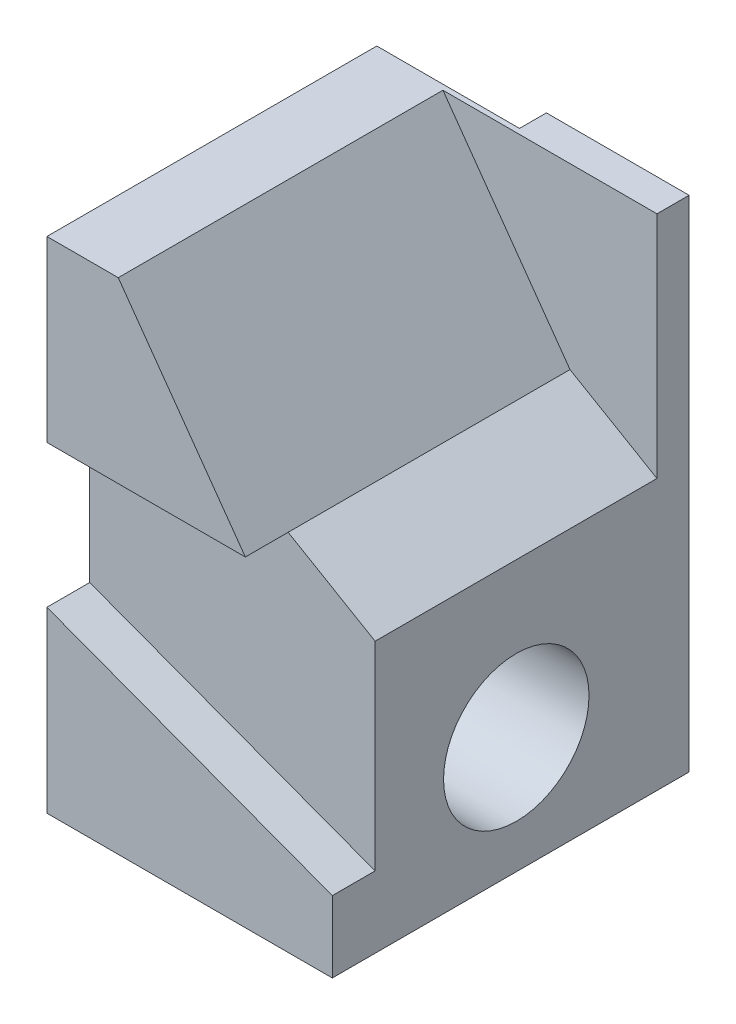
ISO-10303-21;
HEADER;
FILE_DESCRIPTION(('STEP AP214'),'2;1');
FILE_NAME('part.step','',(''),(''),'','','');
FILE_SCHEMA(('AUTOMOTIVE_DESIGN { 1 0 10303 214 1 1 1 1 }'));
ENDSEC;
DATA;
#1=APPLICATION_CONTEXT('core data for automotive mechanical design processes');
#2=APPLICATION_PROTOCOL_DEFINITION('international standard','automotive_design',2000,#1);
#3=PRODUCT_CONTEXT('',#1,'mechanical');
#4=PRODUCT('Part','Part','',(#3));
#5=PRODUCT_RELATED_PRODUCT_CATEGORY('part','',(#4));
#6=PRODUCT_DEFINITION_FORMATION('','',#4);
#7=PRODUCT_DEFINITION_CONTEXT('part definition',#1,'design');
#8=PRODUCT_DEFINITION('design','',#6,#7);
#9=PRODUCT_DEFINITION_SHAPE('','',#8);
#10=(LENGTH_UNIT() NAMED_UNIT(*) SI_UNIT(.MILLI.,.METRE.));
#11=(NAMED_UNIT(*) PLANE_ANGLE_UNIT() SI_UNIT($,.RADIAN.));
#12=(NAMED_UNIT(*) SI_UNIT($,.STERADIAN.) SOLID_ANGLE_UNIT());
#13=UNCERTAINTY_MEASURE_WITH_UNIT(LENGTH_MEASURE(1.E-05),#10,'distance_accuracy_value','');
#14=(GEOMETRIC_REPRESENTATION_CONTEXT(3) GLOBAL_UNCERTAINTY_ASSIGNED_CONTEXT((#13)) GLOBAL_UNIT_ASSIGNED_CONTEXT((#10,
#11,#12)) REPRESENTATION_CONTEXT('',''));
#15=CARTESIAN_POINT('',(0.,0.,0.));
#16=DIRECTION('',(0.,0.,1.));
#17=DIRECTION('',(1.,0.,0.));
#18=AXIS2_PLACEMENT_3D('',#15,#16,#17);
#19=CARTESIAN_POINT('',(-40.,90.,56.));
#20=DIRECTION('',(0.,1.,0.));
#21=DIRECTION('',(0.,0.,1.));
#22=AXIS2_PLACEMENT_3D('',#19,#20,#21);
#23=PLANE('',#22);
#24=DIRECTION('',(1.,0.,0.));
#25=VECTOR('',#24,1.);
#26=CARTESIAN_POINT('',(-40.,90.,44.));
#27=LINE('',#26,#25);
#28=CARTESIAN_POINT('',(-40.,90.,44.));
#29=VERTEX_POINT('',#28);
#30=CARTESIAN_POINT('',(15.6191609276927,90.,44.));
#31=VERTEX_POINT('',#30);
#32=EDGE_CURVE('E172',#29,#31,#27,.T.);
#33=ORIENTED_EDGE('',*,*,#32,.T.);
#34=DIRECTION('',(0.,0.,-1.));
#35=VECTOR('',#34,1.);
#36=CARTESIAN_POINT('',(15.6191609276927,90.,56.));
#37=LINE('',#36,#35);
#38=CARTESIAN_POINT('',(15.6191609276927,90.,56.));
#39=VERTEX_POINT('',#38);
#40=EDGE_CURVE('E157',#39,#31,#37,.T.);
#41=ORIENTED_EDGE('',*,*,#40,.F.);
#42=DIRECTION('',(1.,0.,0.));
#43=VECTOR('',#42,1.);
#44=CARTESIAN_POINT('',(-40.,90.,56.));
#45=LINE('',#44,#43);
#46=CARTESIAN_POINT('',(-40.,90.,56.));
#47=VERTEX_POINT('',#46);
#48=EDGE_CURVE('E178',#47,#39,#45,.T.);
#49=ORIENTED_EDGE('',*,*,#48,.F.);
#50=DIRECTION('',(0.,0.,-1.));
#51=VECTOR('',#50,1.);
#52=CARTESIAN_POINT('',(-40.,90.,56.));
#53=LINE('',#52,#51);
#54=EDGE_CURVE('E187',#47,#29,#53,.T.);
#55=ORIENTED_EDGE('',*,*,#54,.T.);
#56=EDGE_LOOP('',(#33,#41,#49,#55));
#57=FACE_BOUND('',#56,.T.);
#58=ADVANCED_FACE('F41',(#57),#23,.F.);
#59=CARTESIAN_POINT('',(0.,0.,-35.));
#60=DIRECTION('',(0.,0.,1.));
#61=DIRECTION('',(1.,0.,0.));
#62=AXIS2_PLACEMENT_3D('',#59,#60,#61);
#63=PLANE('',#62);
#64=DIRECTION('',(0.580214347267117,-0.814463818242034,0.));
#65=VECTOR('',#64,1.);
#66=CARTESIAN_POINT('',(-20.0002450097908,140.,-35.));
#67=LINE('',#66,#65);
#68=CARTESIAN_POINT('',(-20.0002450097908,140.,-35.));
#69=VERTEX_POINT('',#68);
#70=CARTESIAN_POINT('',(15.6191609276927,90.,-35.));
#71=VERTEX_POINT('',#70);
#72=EDGE_CURVE('E153',#69,#71,#67,.T.);
#73=ORIENTED_EDGE('',*,*,#72,.T.);
#74=DIRECTION('',(0.863497012204882,-0.50435395300646,0.));
#75=VECTOR('',#74,1.);
#76=CARTESIAN_POINT('',(15.6191609276927,90.,-35.));
#77=LINE('',#76,#75);
#78=CARTESIAN_POINT('',(40.,75.759565592087,-35.));
#79=VERTEX_POINT('',#78);
#80=EDGE_CURVE('E137',#71,#79,#77,.T.);
#81=ORIENTED_EDGE('',*,*,#80,.T.);
#82=DIRECTION('',(0.,1.,0.));
#83=VECTOR('',#82,1.);
#84=CARTESIAN_POINT('',(40.,90.,-35.));
#85=LINE('',#84,#83);
#86=CARTESIAN_POINT('',(40.,140.,-35.));
#87=VERTEX_POINT('',#86);
#88=EDGE_CURVE('E163',#79,#87,#85,.T.);
#89=ORIENTED_EDGE('',*,*,#88,.T.);
#90=DIRECTION('',(-1.,0.,0.));
#91=VECTOR('',#90,1.);
#92=CARTESIAN_POINT('',(-20.0002450097908,140.,-35.));
#93=LINE('',#92,#91);
#94=EDGE_CURVE('E162',#87,#69,#93,.T.);
#95=ORIENTED_EDGE('',*,*,#94,.T.);
#96=EDGE_LOOP('',(#73,#81,#89,#95));
#97=FACE_BOUND('',#96,.T.);
#98=ADVANCED_FACE('F160',(#97),#63,.T.);
#99=CARTESIAN_POINT('',(-40.,50.,44.));
#100=DIRECTION('',(0.,0.,-1.));
#101=DIRECTION('',(-1.,0.,0.));
#102=AXIS2_PLACEMENT_3D('',#99,#100,#101);
#103=PLANE('',#102);
#104=DIRECTION('',(0.,-1.,0.));
#105=VECTOR('',#104,1.);
#106=CARTESIAN_POINT('',(40.,50.,44.));
#107=LINE('',#106,#105);
#108=CARTESIAN_POINT('',(40.,75.759565592087,44.));
#109=VERTEX_POINT('',#108);
#110=CARTESIAN_POINT('',(40.,20.,44.));
#111=VERTEX_POINT('',#110);
#112=EDGE_CURVE('E237',#109,#111,#107,.T.);
#113=ORIENTED_EDGE('',*,*,#112,.F.);
#114=DIRECTION('',(0.863497012204882,-0.50435395300646,0.));
#115=VECTOR('',#114,1.);
#116=CARTESIAN_POINT('',(15.6191609276927,90.,44.));
#117=LINE('',#116,#115);
#118=EDGE_CURVE('E146',#31,#109,#117,.T.);
#119=ORIENTED_EDGE('',*,*,#118,.F.);
#120=ORIENTED_EDGE('',*,*,#32,.F.);
#121=DIRECTION('',(0.,-1.,0.));
#122=VECTOR('',#121,1.);
#123=CARTESIAN_POINT('',(-40.,140.,44.));
#124=LINE('',#123,#122);
#125=CARTESIAN_POINT('',(-40.,50.,44.));
#126=VERTEX_POINT('',#125);
#127=EDGE_CURVE('E200',#29,#126,#124,.T.);
#128=ORIENTED_EDGE('',*,*,#127,.T.);
#129=DIRECTION('',(-0.936329177569045,0.351123441588392,0.));
#130=VECTOR('',#129,1.);
#131=CARTESIAN_POINT('',(-40.,50.,44.));
#132=LINE('',#131,#130);
#133=EDGE_CURVE('E213',#111,#126,#132,.T.);
#134=ORIENTED_EDGE('',*,*,#133,.F.);
#135=EDGE_LOOP('',(#113,#119,#120,#128,#134));
#136=FACE_BOUND('',#135,.T.);
#137=ADVANCED_FACE('F267',(#136),#103,.F.);
#138=CARTESIAN_POINT('',(0.,50.,0.));
#139=DIRECTION('',(0.,1.,0.));
#140=DIRECTION('',(0.,0.,1.));
#141=AXIS2_PLACEMENT_3D('',#138,#139,#140);
#142=PLANE('',#141);
#143=DIRECTION('',(-1.,0.,0.));
#144=VECTOR('',#143,1.);
#145=CARTESIAN_POINT('',(-40.,50.,-36.4645937721648));
#146=LINE('',#145,#144);
#147=CARTESIAN_POINT('',(0.,50.,-36.4645937721648));
#148=VERTEX_POINT('',#147);
#149=CARTESIAN_POINT('',(-40.,50.,-36.4645937721648));
#150=VERTEX_POINT('',#149);
#151=EDGE_CURVE('E56',#148,#150,#146,.T.);
#152=ORIENTED_EDGE('',*,*,#151,.F.);
#153=DIRECTION('',(0.,0.,1.));
#154=VECTOR('',#153,1.);
#155=CARTESIAN_POINT('',(0.,50.,-36.4645937721648));
#156=LINE('',#155,#154);
#157=CARTESIAN_POINT('',(0.,50.,-44.));
#158=VERTEX_POINT('',#157);
#159=EDGE_CURVE('E189',#158,#148,#156,.T.);
#160=ORIENTED_EDGE('',*,*,#159,.F.);
#161=DIRECTION('',(-1.,0.,0.));
#162=VECTOR('',#161,1.);
#163=CARTESIAN_POINT('',(-40.,50.,-44.));
#164=LINE('',#163,#162);
#165=CARTESIAN_POINT('',(-40.,50.,-44.));
#166=VERTEX_POINT('',#165);
#167=EDGE_CURVE('E233',#158,#166,#164,.T.);
#168=ORIENTED_EDGE('',*,*,#167,.T.);
#169=DIRECTION('',(0.,0.,1.));
#170=VECTOR('',#169,1.);
#171=CARTESIAN_POINT('',(-40.,50.,-44.));
#172=LINE('',#171,#170);
#173=EDGE_CURVE('E61',#166,#150,#172,.T.);
#174=ORIENTED_EDGE('',*,*,#173,.T.);
#175=EDGE_LOOP('',(#152,#160,#168,#174));
#176=FACE_BOUND('',#175,.T.);
#177=ADVANCED_FACE('F287',(#176),#142,.T.);
#178=CARTESIAN_POINT('',(40.,50.,-44.));
#179=DIRECTION('',(-1.,0.,0.));
#180=DIRECTION('',(0.,0.,1.));
#181=AXIS2_PLACEMENT_3D('',#178,#179,#180);
#182=PLANE('',#181);
#183=ORIENTED_EDGE('',*,*,#88,.F.);
#184=DIRECTION('',(0.,0.,1.));
#185=VECTOR('',#184,1.);
#186=CARTESIAN_POINT('',(40.,75.759565592087,-35.));
#187=LINE('',#186,#185);
#188=EDGE_CURVE('E143',#79,#109,#187,.T.);
#189=ORIENTED_EDGE('',*,*,#188,.T.);
#190=ORIENTED_EDGE('',*,*,#112,.T.);
#191=DIRECTION('',(0.,0.,-1.));
#192=VECTOR('',#191,1.);
#193=CARTESIAN_POINT('',(40.,20.,56.));
#194=LINE('',#193,#192);
#195=CARTESIAN_POINT('',(40.,20.,56.));
#196=VERTEX_POINT('',#195);
#197=EDGE_CURVE('E229',#196,#111,#194,.T.);
#198=ORIENTED_EDGE('',*,*,#197,.F.);
#199=DIRECTION('',(0.,1.,0.));
#200=VECTOR('',#199,1.);
#201=CARTESIAN_POINT('',(40.,0.,56.));
#202=LINE('',#201,#200);
#203=CARTESIAN_POINT('',(40.,0.,56.));
#204=VERTEX_POINT('',#203);
#205=EDGE_CURVE('E217',#204,#196,#202,.T.);
#206=ORIENTED_EDGE('',*,*,#205,.F.);
#207=DIRECTION('',(0.,0.,-1.));
#208=VECTOR('',#207,1.);
#209=CARTESIAN_POINT('',(40.,0.,-44.));
#210=LINE('',#209,#208);
#211=CARTESIAN_POINT('',(40.,0.,-44.));
#212=VERTEX_POINT('',#211);
#213=EDGE_CURVE('E232',#204,#212,#210,.T.);
#214=ORIENTED_EDGE('',*,*,#213,.T.);
#215=DIRECTION('',(0.,-1.,0.));
#216=VECTOR('',#215,1.);
#217=CARTESIAN_POINT('',(40.,50.,-44.));
#218=LINE('',#217,#216);
#219=CARTESIAN_POINT('',(40.,140.,-44.));
#220=VERTEX_POINT('',#219);
#221=EDGE_CURVE('E11',#220,#212,#218,.T.);
#222=ORIENTED_EDGE('',*,*,#221,.F.);
#223=DIRECTION('',(0.,0.,-1.));
#224=VECTOR('',#223,1.);
#225=CARTESIAN_POINT('',(40.,140.,-44.));
#226=LINE('',#225,#224);
#227=EDGE_CURVE('E190',#87,#220,#226,.T.);
#228=ORIENTED_EDGE('',*,*,#227,.F.);
#229=EDGE_LOOP('',(#183,#189,#190,#198,#206,#214,#222,#228));
#230=FACE_BOUND('',#229,.T.);
#231=CARTESIAN_POINT('',(40.,32.6116335293358,4.43808390723074));
#232=DIRECTION('',(1.,0.,0.));
#233=DIRECTION('',(0.,0.,-1.));
#234=AXIS2_PLACEMENT_3D('',#231,#232,#233);
#235=CIRCLE('',#234,20.383603437139);
#236=CARTESIAN_POINT('',(40.,32.6116335293358,-15.9455195299082));
#237=VERTEX_POINT('',#236);
#238=EDGE_CURVE('E158',#237,#237,#235,.T.);
#239=ORIENTED_EDGE('',*,*,#238,.F.);
#240=EDGE_LOOP('',(#239));
#241=FACE_BOUND('',#240,.T.);
#242=ADVANCED_FACE('F43',(#230,#241),#182,.F.);
#243=CARTESIAN_POINT('',(-40.,50.,-44.));
#244=DIRECTION('',(0.,0.,1.));
#245=DIRECTION('',(1.,0.,0.));
#246=AXIS2_PLACEMENT_3D('',#243,#244,#245);
#247=PLANE('',#246);
#248=DIRECTION('',(-1.,0.,0.));
#249=VECTOR('',#248,1.);
#250=CARTESIAN_POINT('',(-40.,0.,-44.));
#251=LINE('',#250,#249);
#252=CARTESIAN_POINT('',(-40.,0.,-44.));
#253=VERTEX_POINT('',#252);
#254=EDGE_CURVE('E240',#212,#253,#251,.T.);
#255=ORIENTED_EDGE('',*,*,#254,.T.);
#256=DIRECTION('',(0.,-1.,0.));
#257=VECTOR('',#256,1.);
#258=CARTESIAN_POINT('',(-40.,50.,-44.));
#259=LINE('',#258,#257);
#260=EDGE_CURVE('E49',#166,#253,#259,.T.);
#261=ORIENTED_EDGE('',*,*,#260,.F.);
#262=ORIENTED_EDGE('',*,*,#167,.F.);
#263=DIRECTION('',(0.,-1.,0.));
#264=VECTOR('',#263,1.);
#265=CARTESIAN_POINT('',(0.,140.,-44.));
#266=LINE('',#265,#264);
#267=CARTESIAN_POINT('',(0.,140.,-44.));
#268=VERTEX_POINT('',#267);
#269=EDGE_CURVE('E210',#268,#158,#266,.T.);
#270=ORIENTED_EDGE('',*,*,#269,.F.);
#271=DIRECTION('',(-1.,0.,0.));
#272=VECTOR('',#271,1.);
#273=CARTESIAN_POINT('',(0.,140.,-44.));
#274=LINE('',#273,#272);
#275=EDGE_CURVE('E192',#220,#268,#274,.T.);
#276=ORIENTED_EDGE('',*,*,#275,.F.);
#277=ORIENTED_EDGE('',*,*,#221,.T.);
#278=EDGE_LOOP('',(#255,#261,#262,#270,#276,#277));
#279=FACE_BOUND('',#278,.T.);
#280=ADVANCED_FACE('F288',(#279),#247,.F.);
#281=CARTESIAN_POINT('',(-40.,50.,-44.));
#282=DIRECTION('',(1.,0.,0.));
#283=DIRECTION('',(0.,0.,-1.));
#284=AXIS2_PLACEMENT_3D('',#281,#282,#283);
#285=PLANE('',#284);
#286=CARTESIAN_POINT('',(-40.,32.6116335293358,4.43808390723075));
#287=DIRECTION('',(1.,0.,0.));
#288=DIRECTION('',(0.,0.,-1.));
#289=AXIS2_PLACEMENT_3D('',#286,#287,#288);
#290=CIRCLE('',#289,20.383603437139);
#291=CARTESIAN_POINT('',(-40.,32.6116335293358,-15.9455195299082));
#292=VERTEX_POINT('',#291);
#293=EDGE_CURVE('E164',#292,#292,#290,.T.);
#294=ORIENTED_EDGE('',*,*,#293,.T.);
#295=EDGE_LOOP('',(#294));
#296=FACE_BOUND('',#295,.T.);
#297=DIRECTION('',(0.,0.,1.));
#298=VECTOR('',#297,1.);
#299=CARTESIAN_POINT('',(-40.,0.,-44.));
#300=LINE('',#299,#298);
#301=CARTESIAN_POINT('',(-40.,0.,56.));
#302=VERTEX_POINT('',#301);
#303=EDGE_CURVE('E235',#253,#302,#300,.T.);
#304=ORIENTED_EDGE('',*,*,#303,.T.);
#305=DIRECTION('',(0.,-1.,0.));
#306=VECTOR('',#305,1.);
#307=CARTESIAN_POINT('',(-40.,50.,56.));
#308=LINE('',#307,#306);
#309=CARTESIAN_POINT('',(-40.,50.,56.));
#310=VERTEX_POINT('',#309);
#311=EDGE_CURVE('E221',#310,#302,#308,.T.);
#312=ORIENTED_EDGE('',*,*,#311,.F.);
#313=DIRECTION('',(0.,0.,-1.));
#314=VECTOR('',#313,1.);
#315=CARTESIAN_POINT('',(-40.,50.,56.));
#316=LINE('',#315,#314);
#317=EDGE_CURVE('E224',#310,#126,#316,.T.);
#318=ORIENTED_EDGE('',*,*,#317,.T.);
#319=ORIENTED_EDGE('',*,*,#127,.F.);
#320=ORIENTED_EDGE('',*,*,#54,.F.);
#321=DIRECTION('',(0.,-1.,0.));
#322=VECTOR('',#321,1.);
#323=CARTESIAN_POINT('',(-40.,140.,56.));
#324=LINE('',#323,#322);
#325=CARTESIAN_POINT('',(-40.,140.,56.));
#326=VERTEX_POINT('',#325);
#327=EDGE_CURVE('E176',#326,#47,#324,.T.);
#328=ORIENTED_EDGE('',*,*,#327,.F.);
#329=DIRECTION('',(0.,0.,1.));
#330=VECTOR('',#329,1.);
#331=CARTESIAN_POINT('',(-40.,140.,44.));
#332=LINE('',#331,#330);
#333=CARTESIAN_POINT('',(-40.,140.,-36.4645937721648));
#334=VERTEX_POINT('',#333);
#335=EDGE_CURVE('E198',#334,#326,#332,.T.);
#336=ORIENTED_EDGE('',*,*,#335,.F.);
#337=DIRECTION('',(0.,-1.,0.));
#338=VECTOR('',#337,1.);
#339=CARTESIAN_POINT('',(-40.,140.,-36.4645937721648));
#340=LINE('',#339,#338);
#341=EDGE_CURVE('E204',#334,#150,#340,.T.);
#342=ORIENTED_EDGE('',*,*,#341,.T.);
#343=ORIENTED_EDGE('',*,*,#173,.F.);
#344=ORIENTED_EDGE('',*,*,#260,.T.);
#345=EDGE_LOOP('',(#304,#312,#318,#319,#320,#328,#336,#342,#343,#344));
#346=FACE_BOUND('',#345,.T.);
#347=ADVANCED_FACE('F247',(#296,#346),#285,.F.);
#348=CARTESIAN_POINT('',(0.,0.,0.));
#349=DIRECTION('',(0.,1.,0.));
#350=DIRECTION('',(0.,0.,1.));
#351=AXIS2_PLACEMENT_3D('',#348,#349,#350);
#352=PLANE('',#351);
#353=ORIENTED_EDGE('',*,*,#213,.F.);
#354=DIRECTION('',(1.,0.,0.));
#355=VECTOR('',#354,1.);
#356=CARTESIAN_POINT('',(-40.,0.,56.));
#357=LINE('',#356,#355);
#358=EDGE_CURVE('E214',#302,#204,#357,.T.);
#359=ORIENTED_EDGE('',*,*,#358,.F.);
#360=ORIENTED_EDGE('',*,*,#303,.F.);
#361=ORIENTED_EDGE('',*,*,#254,.F.);
#362=EDGE_LOOP('',(#353,#359,#360,#361));
#363=FACE_BOUND('',#362,.T.);
#364=ADVANCED_FACE('F253',(#363),#352,.F.);
#365=CARTESIAN_POINT('',(-40.,50.,56.));
#366=DIRECTION('',(-0.351123441588392,-0.936329177569044,0.));
#367=DIRECTION('',(0.936329177569045,-0.351123441588392,0.));
#368=AXIS2_PLACEMENT_3D('',#365,#366,#367);
#369=PLANE('',#368);
#370=ORIENTED_EDGE('',*,*,#133,.T.);
#371=ORIENTED_EDGE('',*,*,#317,.F.);
#372=DIRECTION('',(-0.936329177569045,0.351123441588392,0.));
#373=VECTOR('',#372,1.);
#374=CARTESIAN_POINT('',(-40.,50.,56.));
#375=LINE('',#374,#373);
#376=EDGE_CURVE('E219',#196,#310,#375,.T.);
#377=ORIENTED_EDGE('',*,*,#376,.F.);
#378=ORIENTED_EDGE('',*,*,#197,.T.);
#379=EDGE_LOOP('',(#370,#371,#377,#378));
#380=FACE_BOUND('',#379,.T.);
#381=ADVANCED_FACE('F264',(#380),#369,.F.);
#382=CARTESIAN_POINT('',(0.,0.,56.));
#383=DIRECTION('',(0.,0.,1.));
#384=DIRECTION('',(1.,0.,0.));
#385=AXIS2_PLACEMENT_3D('',#382,#383,#384);
#386=PLANE('',#385);
#387=ORIENTED_EDGE('',*,*,#358,.T.);
#388=ORIENTED_EDGE('',*,*,#205,.T.);
#389=ORIENTED_EDGE('',*,*,#376,.T.);
#390=ORIENTED_EDGE('',*,*,#311,.T.);
#391=EDGE_LOOP('',(#387,#388,#389,#390));
#392=FACE_BOUND('',#391,.T.);
#393=ADVANCED_FACE('F256',(#392),#386,.T.);
#394=CARTESIAN_POINT('',(0.,140.,-36.4645937721648));
#395=DIRECTION('',(1.,0.,0.));
#396=DIRECTION('',(0.,0.,-1.));
#397=AXIS2_PLACEMENT_3D('',#394,#395,#396);
#398=PLANE('',#397);
#399=ORIENTED_EDGE('',*,*,#159,.T.);
#400=DIRECTION('',(0.,-1.,0.));
#401=VECTOR('',#400,1.);
#402=CARTESIAN_POINT('',(0.,140.,-36.4645937721648));
#403=LINE('',#402,#401);
#404=CARTESIAN_POINT('',(0.,140.,-36.4645937721648));
#405=VERTEX_POINT('',#404);
#406=EDGE_CURVE('E207',#405,#148,#403,.T.);
#407=ORIENTED_EDGE('',*,*,#406,.F.);
#408=DIRECTION('',(0.,0.,1.));
#409=VECTOR('',#408,1.);
#410=CARTESIAN_POINT('',(0.,140.,-36.4645937721648));
#411=LINE('',#410,#409);
#412=EDGE_CURVE('E194',#268,#405,#411,.T.);
#413=ORIENTED_EDGE('',*,*,#412,.F.);
#414=ORIENTED_EDGE('',*,*,#269,.T.);
#415=EDGE_LOOP('',(#399,#407,#413,#414));
#416=FACE_BOUND('',#415,.T.);
#417=ADVANCED_FACE('F285',(#416),#398,.F.);
#418=CARTESIAN_POINT('',(-40.,140.,-36.4645937721648));
#419=DIRECTION('',(0.,0.,1.));
#420=DIRECTION('',(1.,0.,0.));
#421=AXIS2_PLACEMENT_3D('',#418,#419,#420);
#422=PLANE('',#421);
#423=ORIENTED_EDGE('',*,*,#151,.T.);
#424=ORIENTED_EDGE('',*,*,#341,.F.);
#425=DIRECTION('',(-1.,0.,0.));
#426=VECTOR('',#425,1.);
#427=CARTESIAN_POINT('',(-20.,140.,-36.4645937721648));
#428=LINE('',#427,#426);
#429=EDGE_CURVE('E196',#405,#334,#428,.T.);
#430=ORIENTED_EDGE('',*,*,#429,.F.);
#431=ORIENTED_EDGE('',*,*,#406,.T.);
#432=EDGE_LOOP('',(#423,#424,#430,#431));
#433=FACE_BOUND('',#432,.T.);
#434=ADVANCED_FACE('F283',(#433),#422,.F.);
#435=CARTESIAN_POINT('',(0.,140.,0.));
#436=DIRECTION('',(0.,-1.,0.));
#437=DIRECTION('',(0.,0.,-1.));
#438=AXIS2_PLACEMENT_3D('',#435,#436,#437);
#439=PLANE('',#438);
#440=DIRECTION('',(0.,0.,-1.));
#441=VECTOR('',#440,1.);
#442=CARTESIAN_POINT('',(-20.0002450097908,140.,56.));
#443=LINE('',#442,#441);
#444=CARTESIAN_POINT('',(-20.0002450097908,140.,56.));
#445=VERTEX_POINT('',#444);
#446=EDGE_CURVE('E182',#445,#69,#443,.T.);
#447=ORIENTED_EDGE('',*,*,#446,.T.);
#448=ORIENTED_EDGE('',*,*,#94,.F.);
#449=ORIENTED_EDGE('',*,*,#227,.T.);
#450=ORIENTED_EDGE('',*,*,#275,.T.);
#451=ORIENTED_EDGE('',*,*,#412,.T.);
#452=ORIENTED_EDGE('',*,*,#429,.T.);
#453=ORIENTED_EDGE('',*,*,#335,.T.);
#454=DIRECTION('',(-1.,0.,0.));
#455=VECTOR('',#454,1.);
#456=CARTESIAN_POINT('',(-40.,140.,56.));
#457=LINE('',#456,#455);
#458=EDGE_CURVE('E173',#445,#326,#457,.T.);
#459=ORIENTED_EDGE('',*,*,#458,.F.);
#460=EDGE_LOOP('',(#447,#448,#449,#450,#451,#452,#453,#459));
#461=FACE_BOUND('',#460,.T.);
#462=ADVANCED_FACE('F277',(#461),#439,.F.);
#463=CARTESIAN_POINT('',(-20.0002450097908,140.,56.));
#464=DIRECTION('',(-0.814463818242034,-0.580214347267117,0.));
#465=DIRECTION('',(0.580214347267117,-0.814463818242034,0.));
#466=AXIS2_PLACEMENT_3D('',#463,#464,#465);
#467=PLANE('',#466);
#468=ORIENTED_EDGE('',*,*,#40,.T.);
#469=DIRECTION('',(0.,0.,1.));
#470=VECTOR('',#469,1.);
#471=CARTESIAN_POINT('',(15.6191609276927,90.,56.));
#472=LINE('',#471,#470);
#473=EDGE_CURVE('E140',#71,#31,#472,.T.);
#474=ORIENTED_EDGE('',*,*,#473,.F.);
#475=ORIENTED_EDGE('',*,*,#72,.F.);
#476=ORIENTED_EDGE('',*,*,#446,.F.);
#477=DIRECTION('',(-0.580214347267117,0.814463818242034,0.));
#478=VECTOR('',#477,1.);
#479=CARTESIAN_POINT('',(-20.0002450097908,140.,56.));
#480=LINE('',#479,#478);
#481=EDGE_CURVE('E180',#39,#445,#480,.T.);
#482=ORIENTED_EDGE('',*,*,#481,.F.);
#483=EDGE_LOOP('',(#468,#474,#475,#476,#482));
#484=FACE_BOUND('',#483,.T.);
#485=ADVANCED_FACE('F151',(#484),#467,.F.);
#486=CARTESIAN_POINT('',(0.,0.,56.));
#487=DIRECTION('',(0.,0.,-1.));
#488=DIRECTION('',(-1.,0.,0.));
#489=AXIS2_PLACEMENT_3D('',#486,#487,#488);
#490=PLANE('',#489);
#491=ORIENTED_EDGE('',*,*,#458,.T.);
#492=ORIENTED_EDGE('',*,*,#327,.T.);
#493=ORIENTED_EDGE('',*,*,#48,.T.);
#494=ORIENTED_EDGE('',*,*,#481,.T.);
#495=EDGE_LOOP('',(#491,#492,#493,#494));
#496=FACE_BOUND('',#495,.T.);
#497=ADVANCED_FACE('F275',(#496),#490,.F.);
#498=CARTESIAN_POINT('',(-40.,32.6116335293358,4.43808390723075));
#499=DIRECTION('',(1.,0.,0.));
#500=DIRECTION('',(0.,0.,-1.));
#501=AXIS2_PLACEMENT_3D('',#498,#499,#500);
#502=CYLINDRICAL_SURFACE('',#501,20.383603437139);
#503=ORIENTED_EDGE('',*,*,#293,.F.);
#504=EDGE_LOOP('',(#503));
#505=FACE_BOUND('',#504,.T.);
#506=ORIENTED_EDGE('',*,*,#238,.T.);
#507=EDGE_LOOP('',(#506));
#508=FACE_BOUND('',#507,.T.);
#509=ADVANCED_FACE('F300',(#505,#508),#502,.F.);
#510=CARTESIAN_POINT('',(15.6191609276927,90.,-35.));
#511=DIRECTION('',(-0.50435395300646,-0.863497012204882,0.));
#512=DIRECTION('',(0.863497012204882,-0.50435395300646,0.));
#513=AXIS2_PLACEMENT_3D('',#510,#511,#512);
#514=PLANE('',#513);
#515=ORIENTED_EDGE('',*,*,#118,.T.);
#516=ORIENTED_EDGE('',*,*,#188,.F.);
#517=ORIENTED_EDGE('',*,*,#80,.F.);
#518=ORIENTED_EDGE('',*,*,#473,.T.);
#519=EDGE_LOOP('',(#515,#516,#517,#518));
#520=FACE_BOUND('',#519,.T.);
#521=ADVANCED_FACE('F139',(#520),#514,.F.);
#522=CLOSED_SHELL('',(#58,#98,#137,#177,#242,#280,#347,#364,#381,#393,#417,#434,#462,#485,#497,
#509,#521));
#523=MANIFOLD_SOLID_BREP('B2',#522);
#524=ADVANCED_BREP_SHAPE_REPRESENTATION('',(#18,#523),#14);
#525=SHAPE_DEFINITION_REPRESENTATION(#9,#524);
ENDSEC;
END-ISO-10303-21;
